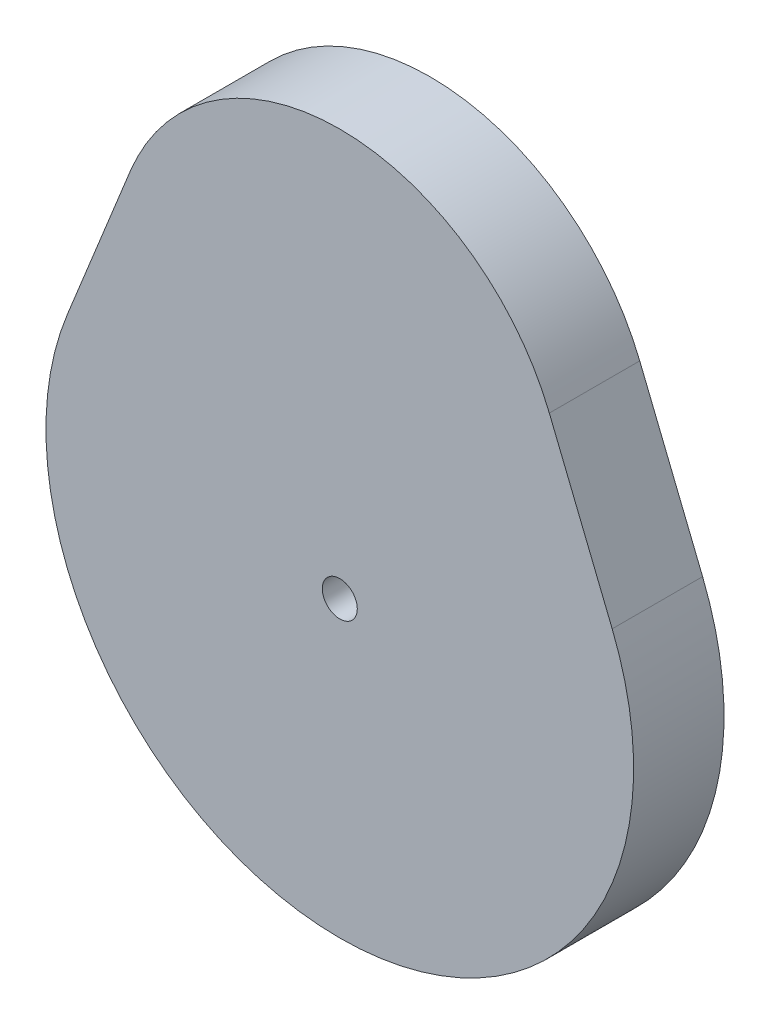
ISO-10303-21;
HEADER;
FILE_DESCRIPTION(('STEP AP214'),'2;1');
FILE_NAME('part.step','',(''),(''),'','','');
FILE_SCHEMA(('AUTOMOTIVE_DESIGN { 1 0 10303 214 1 1 1 1 }'));
ENDSEC;
DATA;
#1=APPLICATION_CONTEXT('core data for automotive mechanical design processes');
#2=APPLICATION_PROTOCOL_DEFINITION('international standard','automotive_design',2000,#1);
#3=PRODUCT_CONTEXT('',#1,'mechanical');
#4=PRODUCT('Part','Part','',(#3));
#5=PRODUCT_RELATED_PRODUCT_CATEGORY('part','',(#4));
#6=PRODUCT_DEFINITION_FORMATION('','',#4);
#7=PRODUCT_DEFINITION_CONTEXT('part definition',#1,'design');
#8=PRODUCT_DEFINITION('design','',#6,#7);
#9=PRODUCT_DEFINITION_SHAPE('','',#8);
#10=(LENGTH_UNIT() NAMED_UNIT(*) SI_UNIT(.MILLI.,.METRE.));
#11=(NAMED_UNIT(*) PLANE_ANGLE_UNIT() SI_UNIT($,.RADIAN.));
#12=(NAMED_UNIT(*) SI_UNIT($,.STERADIAN.) SOLID_ANGLE_UNIT());
#13=UNCERTAINTY_MEASURE_WITH_UNIT(LENGTH_MEASURE(1.E-05),#10,'distance_accuracy_value','');
#14=(GEOMETRIC_REPRESENTATION_CONTEXT(3) GLOBAL_UNCERTAINTY_ASSIGNED_CONTEXT((#13)) GLOBAL_UNIT_ASSIGNED_CONTEXT((#10,
#11,#12)) REPRESENTATION_CONTEXT('',''));
#15=CARTESIAN_POINT('',(0.,0.,0.));
#16=DIRECTION('',(0.,0.,1.));
#17=DIRECTION('',(1.,0.,0.));
#18=AXIS2_PLACEMENT_3D('',#15,#16,#17);
#19=CARTESIAN_POINT('',(0.,0.,0.));
#20=DIRECTION('',(0.,0.,1.));
#21=DIRECTION('',(1.,0.,0.));
#22=AXIS2_PLACEMENT_3D('',#19,#20,#21);
#23=PLANE('',#22);
#24=CARTESIAN_POINT('',(0.,0.,0.));
#25=DIRECTION('',(0.,0.,1.));
#26=DIRECTION('',(1.,0.,0.));
#27=AXIS2_PLACEMENT_3D('',#24,#25,#26);
#28=CIRCLE('',#27,2.45745);
#29=CARTESIAN_POINT('',(2.45745,0.,0.));
#30=VERTEX_POINT('',#29);
#31=EDGE_CURVE('E116',#30,#30,#28,.T.);
#32=ORIENTED_EDGE('',*,*,#31,.T.);
#33=EDGE_LOOP('',(#32));
#34=FACE_BOUND('',#33,.T.);
#35=CARTESIAN_POINT('',(0.,25.4,0.));
#36=DIRECTION('',(0.,0.,1.));
#37=DIRECTION('',(1.,0.,0.));
#38=AXIS2_PLACEMENT_3D('',#35,#36,#37);
#39=CIRCLE('',#38,31.75);
#40=CARTESIAN_POINT('',(29.4330377456609,37.30625,0.));
#41=VERTEX_POINT('',#40);
#42=CARTESIAN_POINT('',(-29.4330377456609,37.30625,0.));
#43=VERTEX_POINT('',#42);
#44=EDGE_CURVE('E120',#41,#43,#39,.T.);
#45=ORIENTED_EDGE('',*,*,#44,.F.);
#46=DIRECTION('',(0.375,-0.927024810886958,0.));
#47=VECTOR('',#46,1.);
#48=CARTESIAN_POINT('',(38.2629490693592,15.478125,0.));
#49=LINE('',#48,#47);
#50=CARTESIAN_POINT('',(38.2629490693592,15.478125,0.));
#51=VERTEX_POINT('',#50);
#52=EDGE_CURVE('E118',#41,#51,#49,.T.);
#53=ORIENTED_EDGE('',*,*,#52,.T.);
#54=CARTESIAN_POINT('',(0.,0.,0.));
#55=DIRECTION('',(0.,0.,1.));
#56=DIRECTION('',(1.,0.,0.));
#57=AXIS2_PLACEMENT_3D('',#54,#55,#56);
#58=CIRCLE('',#57,41.275);
#59=CARTESIAN_POINT('',(-38.2629490693592,15.478125,0.));
#60=VERTEX_POINT('',#59);
#61=EDGE_CURVE('E104',#60,#51,#58,.T.);
#62=ORIENTED_EDGE('',*,*,#61,.F.);
#63=DIRECTION('',(-0.375,-0.927024810886958,0.));
#64=VECTOR('',#63,1.);
#65=CARTESIAN_POINT('',(-38.2629490693592,15.478125,0.));
#66=LINE('',#65,#64);
#67=EDGE_CURVE('E114',#43,#60,#66,.T.);
#68=ORIENTED_EDGE('',*,*,#67,.F.);
#69=EDGE_LOOP('',(#45,#53,#62,#68));
#70=FACE_BOUND('',#69,.T.);
#71=ADVANCED_FACE('F50',(#34,#70),#23,.F.);
#72=CARTESIAN_POINT('',(0.,25.4,12.7));
#73=DIRECTION('',(0.,0.,-1.));
#74=DIRECTION('',(-1.,0.,0.));
#75=AXIS2_PLACEMENT_3D('',#72,#73,#74);
#76=CYLINDRICAL_SURFACE('',#75,31.75);
#77=ORIENTED_EDGE('',*,*,#44,.T.);
#78=DIRECTION('',(0.,0.,-1.));
#79=VECTOR('',#78,1.);
#80=CARTESIAN_POINT('',(-29.4330377456609,37.30625,12.7));
#81=LINE('',#80,#79);
#82=CARTESIAN_POINT('',(-29.4330377456609,37.30625,12.7));
#83=VERTEX_POINT('',#82);
#84=EDGE_CURVE('E67',#83,#43,#81,.T.);
#85=ORIENTED_EDGE('',*,*,#84,.F.);
#86=CARTESIAN_POINT('',(0.,25.4,12.7));
#87=DIRECTION('',(0.,0.,1.));
#88=DIRECTION('',(1.,0.,0.));
#89=AXIS2_PLACEMENT_3D('',#86,#87,#88);
#90=CIRCLE('',#89,31.75);
#91=CARTESIAN_POINT('',(29.4330377456609,37.30625,12.7));
#92=VERTEX_POINT('',#91);
#93=EDGE_CURVE('E109',#92,#83,#90,.T.);
#94=ORIENTED_EDGE('',*,*,#93,.F.);
#95=DIRECTION('',(0.,0.,-1.));
#96=VECTOR('',#95,1.);
#97=CARTESIAN_POINT('',(29.4330377456609,37.30625,12.7));
#98=LINE('',#97,#96);
#99=EDGE_CURVE('E81',#92,#41,#98,.T.);
#100=ORIENTED_EDGE('',*,*,#99,.T.);
#101=EDGE_LOOP('',(#77,#85,#94,#100));
#102=FACE_BOUND('',#101,.T.);
#103=ADVANCED_FACE('F134',(#102),#76,.T.);
#104=CARTESIAN_POINT('',(0.,0.,12.7));
#105=DIRECTION('',(0.,0.,1.));
#106=DIRECTION('',(1.,0.,0.));
#107=AXIS2_PLACEMENT_3D('',#104,#105,#106);
#108=PLANE('',#107);
#109=CARTESIAN_POINT('',(0.,0.,12.7));
#110=DIRECTION('',(0.,0.,1.));
#111=DIRECTION('',(1.,0.,0.));
#112=AXIS2_PLACEMENT_3D('',#109,#110,#111);
#113=CIRCLE('',#112,2.45745);
#114=CARTESIAN_POINT('',(2.45745,0.,12.7));
#115=VERTEX_POINT('',#114);
#116=EDGE_CURVE('E127',#115,#115,#113,.T.);
#117=ORIENTED_EDGE('',*,*,#116,.F.);
#118=EDGE_LOOP('',(#117));
#119=FACE_BOUND('',#118,.T.);
#120=ORIENTED_EDGE('',*,*,#93,.T.);
#121=DIRECTION('',(-0.375,-0.927024810886958,0.));
#122=VECTOR('',#121,1.);
#123=CARTESIAN_POINT('',(-38.2629490693592,15.478125,12.7));
#124=LINE('',#123,#122);
#125=CARTESIAN_POINT('',(-38.2629490693592,15.478125,12.7));
#126=VERTEX_POINT('',#125);
#127=EDGE_CURVE('E99',#83,#126,#124,.T.);
#128=ORIENTED_EDGE('',*,*,#127,.T.);
#129=CARTESIAN_POINT('',(0.,0.,12.7));
#130=DIRECTION('',(0.,0.,1.));
#131=DIRECTION('',(1.,0.,0.));
#132=AXIS2_PLACEMENT_3D('',#129,#130,#131);
#133=CIRCLE('',#132,41.275);
#134=CARTESIAN_POINT('',(38.2629490693592,15.478125,12.7));
#135=VERTEX_POINT('',#134);
#136=EDGE_CURVE('E92',#126,#135,#133,.T.);
#137=ORIENTED_EDGE('',*,*,#136,.T.);
#138=DIRECTION('',(0.375,-0.927024810886958,0.));
#139=VECTOR('',#138,1.);
#140=CARTESIAN_POINT('',(38.2629490693592,15.478125,12.7));
#141=LINE('',#140,#139);
#142=EDGE_CURVE('E98',#92,#135,#141,.T.);
#143=ORIENTED_EDGE('',*,*,#142,.F.);
#144=EDGE_LOOP('',(#120,#128,#137,#143));
#145=FACE_BOUND('',#144,.T.);
#146=ADVANCED_FACE('F96',(#119,#145),#108,.T.);
#147=CARTESIAN_POINT('',(-38.2629490693592,15.478125,12.7));
#148=DIRECTION('',(0.927024810886958,-0.375,0.));
#149=DIRECTION('',(0.375,0.927024810886958,0.));
#150=AXIS2_PLACEMENT_3D('',#147,#148,#149);
#151=PLANE('',#150);
#152=ORIENTED_EDGE('',*,*,#67,.T.);
#153=DIRECTION('',(0.,0.,-1.));
#154=VECTOR('',#153,1.);
#155=CARTESIAN_POINT('',(-38.2629490693592,15.478125,12.7));
#156=LINE('',#155,#154);
#157=EDGE_CURVE('E12',#126,#60,#156,.T.);
#158=ORIENTED_EDGE('',*,*,#157,.F.);
#159=ORIENTED_EDGE('',*,*,#127,.F.);
#160=ORIENTED_EDGE('',*,*,#84,.T.);
#161=EDGE_LOOP('',(#152,#158,#159,#160));
#162=FACE_BOUND('',#161,.T.);
#163=ADVANCED_FACE('F52',(#162),#151,.F.);
#164=CARTESIAN_POINT('',(0.,0.,12.7));
#165=DIRECTION('',(0.,0.,-1.));
#166=DIRECTION('',(-1.,0.,0.));
#167=AXIS2_PLACEMENT_3D('',#164,#165,#166);
#168=CYLINDRICAL_SURFACE('',#167,41.275);
#169=ORIENTED_EDGE('',*,*,#61,.T.);
#170=DIRECTION('',(0.,0.,-1.));
#171=VECTOR('',#170,1.);
#172=CARTESIAN_POINT('',(38.2629490693592,15.478125,12.7));
#173=LINE('',#172,#171);
#174=EDGE_CURVE('E59',#135,#51,#173,.T.);
#175=ORIENTED_EDGE('',*,*,#174,.F.);
#176=ORIENTED_EDGE('',*,*,#136,.F.);
#177=ORIENTED_EDGE('',*,*,#157,.T.);
#178=EDGE_LOOP('',(#169,#175,#176,#177));
#179=FACE_BOUND('',#178,.T.);
#180=ADVANCED_FACE('F103',(#179),#168,.T.);
#181=CARTESIAN_POINT('',(38.2629490693592,15.478125,12.7));
#182=DIRECTION('',(0.927024810886958,0.375,0.));
#183=DIRECTION('',(-0.375,0.927024810886958,0.));
#184=AXIS2_PLACEMENT_3D('',#181,#182,#183);
#185=PLANE('',#184);
#186=ORIENTED_EDGE('',*,*,#52,.F.);
#187=ORIENTED_EDGE('',*,*,#99,.F.);
#188=ORIENTED_EDGE('',*,*,#142,.T.);
#189=ORIENTED_EDGE('',*,*,#174,.T.);
#190=EDGE_LOOP('',(#186,#187,#188,#189));
#191=FACE_BOUND('',#190,.T.);
#192=ADVANCED_FACE('F108',(#191),#185,.T.);
#193=CARTESIAN_POINT('',(0.,0.,12.7));
#194=DIRECTION('',(0.,0.,1.));
#195=DIRECTION('',(1.,0.,0.));
#196=AXIS2_PLACEMENT_3D('',#193,#194,#195);
#197=CYLINDRICAL_SURFACE('',#196,2.45745);
#198=ORIENTED_EDGE('',*,*,#31,.F.);
#199=EDGE_LOOP('',(#198));
#200=FACE_BOUND('',#199,.T.);
#201=ORIENTED_EDGE('',*,*,#116,.T.);
#202=EDGE_LOOP('',(#201));
#203=FACE_BOUND('',#202,.T.);
#204=ADVANCED_FACE('F131',(#200,#203),#197,.F.);
#205=CLOSED_SHELL('',(#71,#103,#146,#163,#180,#192,#204));
#206=MANIFOLD_SOLID_BREP('B2',#205);
#207=ADVANCED_BREP_SHAPE_REPRESENTATION('',(#18,#206),#14);
#208=SHAPE_DEFINITION_REPRESENTATION(#9,#207);
ENDSEC;
END-ISO-10303-21;
